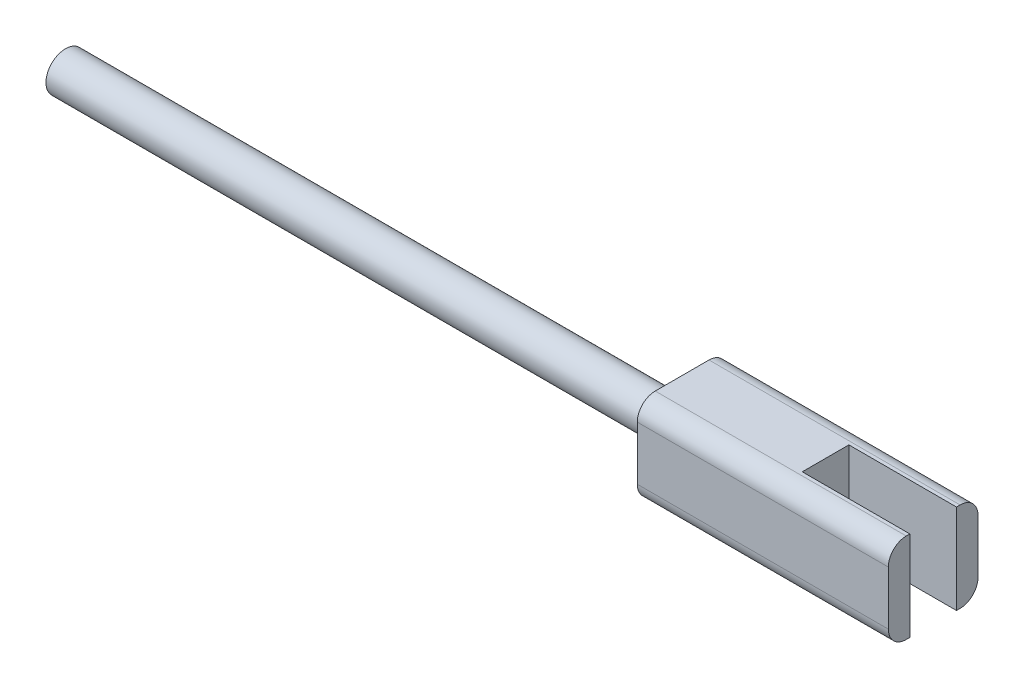
ISO-10303-21;
HEADER;
FILE_DESCRIPTION(('STEP AP214'),'2;1');
FILE_NAME('part.step','',(''),(''),'','','');
FILE_SCHEMA(('AUTOMOTIVE_DESIGN { 1 0 10303 214 1 1 1 1 }'));
ENDSEC;
DATA;
#1=APPLICATION_CONTEXT('core data for automotive mechanical design processes');
#2=APPLICATION_PROTOCOL_DEFINITION('international standard','automotive_design',2000,#1);
#3=PRODUCT_CONTEXT('',#1,'mechanical');
#4=PRODUCT('Part','Part','',(#3));
#5=PRODUCT_RELATED_PRODUCT_CATEGORY('part','',(#4));
#6=PRODUCT_DEFINITION_FORMATION('','',#4);
#7=PRODUCT_DEFINITION_CONTEXT('part definition',#1,'design');
#8=PRODUCT_DEFINITION('design','',#6,#7);
#9=PRODUCT_DEFINITION_SHAPE('','',#8);
#10=(LENGTH_UNIT() NAMED_UNIT(*) SI_UNIT(.MILLI.,.METRE.));
#11=(NAMED_UNIT(*) PLANE_ANGLE_UNIT() SI_UNIT($,.RADIAN.));
#12=(NAMED_UNIT(*) SI_UNIT($,.STERADIAN.) SOLID_ANGLE_UNIT());
#13=UNCERTAINTY_MEASURE_WITH_UNIT(LENGTH_MEASURE(1.E-05),#10,'distance_accuracy_value','');
#14=(GEOMETRIC_REPRESENTATION_CONTEXT(3) GLOBAL_UNCERTAINTY_ASSIGNED_CONTEXT((#13)) GLOBAL_UNIT_ASSIGNED_CONTEXT((#10,
#11,#12)) REPRESENTATION_CONTEXT('',''));
#15=CARTESIAN_POINT('',(0.,0.,0.));
#16=DIRECTION('',(0.,0.,1.));
#17=DIRECTION('',(1.,0.,0.));
#18=AXIS2_PLACEMENT_3D('',#15,#16,#17);
#19=CARTESIAN_POINT('',(48.385,-1.5,1.5));
#20=DIRECTION('',(1.,0.,0.));
#21=DIRECTION('',(0.,0.,-1.));
#22=AXIS2_PLACEMENT_3D('',#19,#20,#21);
#23=PLANE('',#22);
#24=DIRECTION('',(0.,1.,0.));
#25=VECTOR('',#24,1.);
#26=CARTESIAN_POINT('',(48.385,-1.5,-1.3));
#27=LINE('',#26,#25);
#28=CARTESIAN_POINT('',(48.385,-2.5,-1.3));
#29=VERTEX_POINT('',#28);
#30=CARTESIAN_POINT('',(48.385,2.5,-1.3));
#31=VERTEX_POINT('',#30);
#32=EDGE_CURVE('E11',#29,#31,#27,.T.);
#33=ORIENTED_EDGE('',*,*,#32,.F.);
#34=DIRECTION('',(0.,0.,-1.));
#35=VECTOR('',#34,1.);
#36=CARTESIAN_POINT('',(48.385,-2.5,1.5));
#37=LINE('',#36,#35);
#38=CARTESIAN_POINT('',(48.385,-2.5,-1.5));
#39=VERTEX_POINT('',#38);
#40=EDGE_CURVE('E202',#29,#39,#37,.T.);
#41=ORIENTED_EDGE('',*,*,#40,.T.);
#42=CARTESIAN_POINT('',(48.385,-1.5,-1.5));
#43=DIRECTION('',(1.,0.,0.));
#44=DIRECTION('',(0.,0.,-1.));
#45=AXIS2_PLACEMENT_3D('',#42,#43,#44);
#46=CIRCLE('',#45,1.);
#47=CARTESIAN_POINT('',(48.385,-1.5,-2.5));
#48=VERTEX_POINT('',#47);
#49=EDGE_CURVE('E201',#39,#48,#46,.T.);
#50=ORIENTED_EDGE('',*,*,#49,.T.);
#51=DIRECTION('',(0.,1.,0.));
#52=VECTOR('',#51,1.);
#53=CARTESIAN_POINT('',(48.385,-1.5,-2.5));
#54=LINE('',#53,#52);
#55=CARTESIAN_POINT('',(48.385,1.5,-2.5));
#56=VERTEX_POINT('',#55);
#57=EDGE_CURVE('E204',#48,#56,#54,.T.);
#58=ORIENTED_EDGE('',*,*,#57,.T.);
#59=CARTESIAN_POINT('',(48.385,1.5,-1.5));
#60=DIRECTION('',(1.,0.,0.));
#61=DIRECTION('',(0.,0.,-1.));
#62=AXIS2_PLACEMENT_3D('',#59,#60,#61);
#63=CIRCLE('',#62,1.);
#64=CARTESIAN_POINT('',(48.385,2.5,-1.5));
#65=VERTEX_POINT('',#64);
#66=EDGE_CURVE('E129',#56,#65,#63,.T.);
#67=ORIENTED_EDGE('',*,*,#66,.T.);
#68=DIRECTION('',(0.,0.,1.));
#69=VECTOR('',#68,1.);
#70=CARTESIAN_POINT('',(48.385,2.5,-1.5));
#71=LINE('',#70,#69);
#72=EDGE_CURVE('E128',#65,#31,#71,.T.);
#73=ORIENTED_EDGE('',*,*,#72,.T.);
#74=EDGE_LOOP('',(#33,#41,#50,#58,#67,#73));
#75=FACE_BOUND('',#74,.T.);
#76=ADVANCED_FACE('F39',(#75),#23,.T.);
#77=CARTESIAN_POINT('',(36.385,0.,0.));
#78=DIRECTION('',(-1.,0.,0.));
#79=DIRECTION('',(0.,0.,1.));
#80=AXIS2_PLACEMENT_3D('',#77,#78,#79);
#81=CYLINDRICAL_SURFACE('',#80,1.09);
#82=CARTESIAN_POINT('',(0.,0.,0.));
#83=DIRECTION('',(1.,0.,0.));
#84=DIRECTION('',(0.,0.,-1.));
#85=AXIS2_PLACEMENT_3D('',#82,#83,#84);
#86=CIRCLE('',#85,1.09);
#87=CARTESIAN_POINT('',(0.,0.,-1.09));
#88=VERTEX_POINT('',#87);
#89=EDGE_CURVE('E181',#88,#88,#86,.T.);
#90=ORIENTED_EDGE('',*,*,#89,.T.);
#91=EDGE_LOOP('',(#90));
#92=FACE_BOUND('',#91,.T.);
#93=CARTESIAN_POINT('',(34.385,0.,0.));
#94=DIRECTION('',(1.,0.,0.));
#95=DIRECTION('',(0.,0.,-1.));
#96=AXIS2_PLACEMENT_3D('',#93,#94,#95);
#97=CIRCLE('',#96,1.09);
#98=CARTESIAN_POINT('',(34.385,0.,-1.09));
#99=VERTEX_POINT('',#98);
#100=EDGE_CURVE('E184',#99,#99,#97,.T.);
#101=ORIENTED_EDGE('',*,*,#100,.F.);
#102=EDGE_LOOP('',(#101));
#103=FACE_BOUND('',#102,.T.);
#104=ADVANCED_FACE('F41',(#92,#103),#81,.T.);
#105=CARTESIAN_POINT('',(0.,0.,0.));
#106=DIRECTION('',(1.,0.,0.));
#107=DIRECTION('',(0.,0.,-1.));
#108=AXIS2_PLACEMENT_3D('',#105,#106,#107);
#109=PLANE('',#108);
#110=ORIENTED_EDGE('',*,*,#89,.F.);
#111=EDGE_LOOP('',(#110));
#112=FACE_BOUND('',#111,.T.);
#113=ADVANCED_FACE('F264',(#112),#109,.F.);
#114=CARTESIAN_POINT('',(48.385,-1.5,1.5));
#115=DIRECTION('',(-1.,0.,0.));
#116=DIRECTION('',(0.,0.,1.));
#117=AXIS2_PLACEMENT_3D('',#114,#115,#116);
#118=CYLINDRICAL_SURFACE('',#117,1.);
#119=CARTESIAN_POINT('',(34.385,-1.5,1.5));
#120=DIRECTION('',(1.,0.,0.));
#121=DIRECTION('',(0.,0.,-1.));
#122=AXIS2_PLACEMENT_3D('',#119,#120,#121);
#123=CIRCLE('',#122,1.);
#124=CARTESIAN_POINT('',(34.385,-1.5,2.5));
#125=VERTEX_POINT('',#124);
#126=CARTESIAN_POINT('',(34.385,-2.5,1.5));
#127=VERTEX_POINT('',#126);
#128=EDGE_CURVE('E150',#125,#127,#123,.T.);
#129=ORIENTED_EDGE('',*,*,#128,.T.);
#130=DIRECTION('',(-1.,0.,0.));
#131=VECTOR('',#130,1.);
#132=CARTESIAN_POINT('',(48.385,-2.5,1.5));
#133=LINE('',#132,#131);
#134=CARTESIAN_POINT('',(48.385,-2.5,1.5));
#135=VERTEX_POINT('',#134);
#136=EDGE_CURVE('E179',#135,#127,#133,.T.);
#137=ORIENTED_EDGE('',*,*,#136,.F.);
#138=CARTESIAN_POINT('',(48.385,-1.5,1.5));
#139=DIRECTION('',(1.,0.,0.));
#140=DIRECTION('',(0.,0.,-1.));
#141=AXIS2_PLACEMENT_3D('',#138,#139,#140);
#142=CIRCLE('',#141,1.);
#143=CARTESIAN_POINT('',(48.385,-1.5,2.5));
#144=VERTEX_POINT('',#143);
#145=EDGE_CURVE('E166',#144,#135,#142,.T.);
#146=ORIENTED_EDGE('',*,*,#145,.F.);
#147=DIRECTION('',(-1.,0.,0.));
#148=VECTOR('',#147,1.);
#149=CARTESIAN_POINT('',(48.385,-1.5,2.5));
#150=LINE('',#149,#148);
#151=EDGE_CURVE('E145',#144,#125,#150,.T.);
#152=ORIENTED_EDGE('',*,*,#151,.T.);
#153=EDGE_LOOP('',(#129,#137,#146,#152));
#154=FACE_BOUND('',#153,.T.);
#155=ADVANCED_FACE('F262',(#154),#118,.T.);
#156=CARTESIAN_POINT('',(48.385,-2.5,1.5));
#157=DIRECTION('',(0.,1.,0.));
#158=DIRECTION('',(0.,0.,1.));
#159=AXIS2_PLACEMENT_3D('',#156,#157,#158);
#160=PLANE('',#159);
#161=ORIENTED_EDGE('',*,*,#40,.F.);
#162=DIRECTION('',(-1.,0.,0.));
#163=VECTOR('',#162,1.);
#164=CARTESIAN_POINT('',(42.385,-2.5,-1.3));
#165=LINE('',#164,#163);
#166=CARTESIAN_POINT('',(42.385,-2.5,-1.3));
#167=VERTEX_POINT('',#166);
#168=EDGE_CURVE('E197',#29,#167,#165,.T.);
#169=ORIENTED_EDGE('',*,*,#168,.T.);
#170=DIRECTION('',(0.,0.,1.));
#171=VECTOR('',#170,1.);
#172=CARTESIAN_POINT('',(42.385,-2.5,1.3));
#173=LINE('',#172,#171);
#174=CARTESIAN_POINT('',(42.385,-2.5,1.3));
#175=VERTEX_POINT('',#174);
#176=EDGE_CURVE('E196',#167,#175,#173,.T.);
#177=ORIENTED_EDGE('',*,*,#176,.T.);
#178=DIRECTION('',(1.,0.,0.));
#179=VECTOR('',#178,1.);
#180=CARTESIAN_POINT('',(49.385,-2.5,1.3));
#181=LINE('',#180,#179);
#182=CARTESIAN_POINT('',(48.385,-2.5,1.3));
#183=VERTEX_POINT('',#182);
#184=EDGE_CURVE('E189',#175,#183,#181,.T.);
#185=ORIENTED_EDGE('',*,*,#184,.T.);
#186=EDGE_CURVE('E105',#135,#183,#37,.T.);
#187=ORIENTED_EDGE('',*,*,#186,.F.);
#188=ORIENTED_EDGE('',*,*,#136,.T.);
#189=DIRECTION('',(0.,0.,-1.));
#190=VECTOR('',#189,1.);
#191=CARTESIAN_POINT('',(34.385,-2.5,1.5));
#192=LINE('',#191,#190);
#193=CARTESIAN_POINT('',(34.385,-2.5,-1.5));
#194=VERTEX_POINT('',#193);
#195=EDGE_CURVE('E153',#127,#194,#192,.T.);
#196=ORIENTED_EDGE('',*,*,#195,.T.);
#197=DIRECTION('',(-1.,0.,0.));
#198=VECTOR('',#197,1.);
#199=CARTESIAN_POINT('',(48.385,-2.5,-1.5));
#200=LINE('',#199,#198);
#201=EDGE_CURVE('E176',#39,#194,#200,.T.);
#202=ORIENTED_EDGE('',*,*,#201,.F.);
#203=EDGE_LOOP('',(#161,#169,#177,#185,#187,#188,#196,#202));
#204=FACE_BOUND('',#203,.T.);
#205=ADVANCED_FACE('F193',(#204),#160,.F.);
#206=CARTESIAN_POINT('',(48.385,-1.5,-1.5));
#207=DIRECTION('',(-1.,0.,0.));
#208=DIRECTION('',(0.,0.,1.));
#209=AXIS2_PLACEMENT_3D('',#206,#207,#208);
#210=CYLINDRICAL_SURFACE('',#209,1.);
#211=CARTESIAN_POINT('',(34.385,-1.5,-1.5));
#212=DIRECTION('',(1.,0.,0.));
#213=DIRECTION('',(0.,0.,-1.));
#214=AXIS2_PLACEMENT_3D('',#211,#212,#213);
#215=CIRCLE('',#214,1.);
#216=CARTESIAN_POINT('',(34.385,-1.5,-2.5));
#217=VERTEX_POINT('',#216);
#218=EDGE_CURVE('E156',#194,#217,#215,.T.);
#219=ORIENTED_EDGE('',*,*,#218,.T.);
#220=DIRECTION('',(-1.,0.,0.));
#221=VECTOR('',#220,1.);
#222=CARTESIAN_POINT('',(48.385,-1.5,-2.5));
#223=LINE('',#222,#221);
#224=EDGE_CURVE('E173',#48,#217,#223,.T.);
#225=ORIENTED_EDGE('',*,*,#224,.F.);
#226=ORIENTED_EDGE('',*,*,#49,.F.);
#227=ORIENTED_EDGE('',*,*,#201,.T.);
#228=EDGE_LOOP('',(#219,#225,#226,#227));
#229=FACE_BOUND('',#228,.T.);
#230=ADVANCED_FACE('F253',(#229),#210,.T.);
#231=CARTESIAN_POINT('',(48.385,-1.5,-2.5));
#232=DIRECTION('',(0.,0.,1.));
#233=DIRECTION('',(1.,0.,0.));
#234=AXIS2_PLACEMENT_3D('',#231,#232,#233);
#235=PLANE('',#234);
#236=DIRECTION('',(0.,1.,0.));
#237=VECTOR('',#236,1.);
#238=CARTESIAN_POINT('',(34.385,-1.5,-2.5));
#239=LINE('',#238,#237);
#240=CARTESIAN_POINT('',(34.385,1.5,-2.5));
#241=VERTEX_POINT('',#240);
#242=EDGE_CURVE('E158',#217,#241,#239,.T.);
#243=ORIENTED_EDGE('',*,*,#242,.T.);
#244=DIRECTION('',(-1.,0.,0.));
#245=VECTOR('',#244,1.);
#246=CARTESIAN_POINT('',(48.385,1.5,-2.5));
#247=LINE('',#246,#245);
#248=EDGE_CURVE('E170',#56,#241,#247,.T.);
#249=ORIENTED_EDGE('',*,*,#248,.F.);
#250=ORIENTED_EDGE('',*,*,#57,.F.);
#251=ORIENTED_EDGE('',*,*,#224,.T.);
#252=EDGE_LOOP('',(#243,#249,#250,#251));
#253=FACE_BOUND('',#252,.T.);
#254=ADVANCED_FACE('F256',(#253),#235,.F.);
#255=CARTESIAN_POINT('',(48.385,1.5,-1.5));
#256=DIRECTION('',(-1.,0.,0.));
#257=DIRECTION('',(0.,0.,1.));
#258=AXIS2_PLACEMENT_3D('',#255,#256,#257);
#259=CYLINDRICAL_SURFACE('',#258,1.);
#260=CARTESIAN_POINT('',(34.385,1.5,-1.5));
#261=DIRECTION('',(1.,0.,0.));
#262=DIRECTION('',(0.,0.,-1.));
#263=AXIS2_PLACEMENT_3D('',#260,#261,#262);
#264=CIRCLE('',#263,1.);
#265=CARTESIAN_POINT('',(34.385,2.5,-1.5));
#266=VERTEX_POINT('',#265);
#267=EDGE_CURVE('E160',#241,#266,#264,.T.);
#268=ORIENTED_EDGE('',*,*,#267,.T.);
#269=DIRECTION('',(-1.,0.,0.));
#270=VECTOR('',#269,1.);
#271=CARTESIAN_POINT('',(48.385,2.5,-1.5));
#272=LINE('',#271,#270);
#273=EDGE_CURVE('E140',#65,#266,#272,.T.);
#274=ORIENTED_EDGE('',*,*,#273,.F.);
#275=ORIENTED_EDGE('',*,*,#66,.F.);
#276=ORIENTED_EDGE('',*,*,#248,.T.);
#277=EDGE_LOOP('',(#268,#274,#275,#276));
#278=FACE_BOUND('',#277,.T.);
#279=ADVANCED_FACE('F218',(#278),#259,.T.);
#280=CARTESIAN_POINT('',(48.385,2.5,-1.5));
#281=DIRECTION('',(0.,-1.,0.));
#282=DIRECTION('',(0.,0.,-1.));
#283=AXIS2_PLACEMENT_3D('',#280,#281,#282);
#284=PLANE('',#283);
#285=DIRECTION('',(0.,0.,1.));
#286=VECTOR('',#285,1.);
#287=CARTESIAN_POINT('',(42.385,2.5,1.3));
#288=LINE('',#287,#286);
#289=CARTESIAN_POINT('',(42.385,2.5,-1.3));
#290=VERTEX_POINT('',#289);
#291=CARTESIAN_POINT('',(42.385,2.5,1.3));
#292=VERTEX_POINT('',#291);
#293=EDGE_CURVE('E225',#290,#292,#288,.T.);
#294=ORIENTED_EDGE('',*,*,#293,.F.);
#295=DIRECTION('',(-1.,0.,0.));
#296=VECTOR('',#295,1.);
#297=CARTESIAN_POINT('',(42.385,2.5,-1.3));
#298=LINE('',#297,#296);
#299=EDGE_CURVE('E222',#31,#290,#298,.T.);
#300=ORIENTED_EDGE('',*,*,#299,.F.);
#301=ORIENTED_EDGE('',*,*,#72,.F.);
#302=ORIENTED_EDGE('',*,*,#273,.T.);
#303=DIRECTION('',(0.,0.,1.));
#304=VECTOR('',#303,1.);
#305=CARTESIAN_POINT('',(34.385,2.5,-1.5));
#306=LINE('',#305,#304);
#307=CARTESIAN_POINT('',(34.385,2.5,1.5));
#308=VERTEX_POINT('',#307);
#309=EDGE_CURVE('E137',#266,#308,#306,.T.);
#310=ORIENTED_EDGE('',*,*,#309,.T.);
#311=DIRECTION('',(-1.,0.,0.));
#312=VECTOR('',#311,1.);
#313=CARTESIAN_POINT('',(48.385,2.5,1.5));
#314=LINE('',#313,#312);
#315=CARTESIAN_POINT('',(48.385,2.5,1.5));
#316=VERTEX_POINT('',#315);
#317=EDGE_CURVE('E132',#316,#308,#314,.T.);
#318=ORIENTED_EDGE('',*,*,#317,.F.);
#319=CARTESIAN_POINT('',(48.385,2.5,1.3));
#320=VERTEX_POINT('',#319);
#321=EDGE_CURVE('E121',#320,#316,#71,.T.);
#322=ORIENTED_EDGE('',*,*,#321,.F.);
#323=DIRECTION('',(1.,0.,0.));
#324=VECTOR('',#323,1.);
#325=CARTESIAN_POINT('',(49.385,2.5,1.3));
#326=LINE('',#325,#324);
#327=EDGE_CURVE('E54',#292,#320,#326,.T.);
#328=ORIENTED_EDGE('',*,*,#327,.F.);
#329=EDGE_LOOP('',(#294,#300,#301,#302,#310,#318,#322,#328));
#330=FACE_BOUND('',#329,.T.);
#331=ADVANCED_FACE('F134',(#330),#284,.F.);
#332=CARTESIAN_POINT('',(48.385,1.5,1.5));
#333=DIRECTION('',(-1.,0.,0.));
#334=DIRECTION('',(0.,0.,1.));
#335=AXIS2_PLACEMENT_3D('',#332,#333,#334);
#336=CYLINDRICAL_SURFACE('',#335,1.);
#337=CARTESIAN_POINT('',(34.385,1.5,1.5));
#338=DIRECTION('',(1.,0.,0.));
#339=DIRECTION('',(0.,0.,-1.));
#340=AXIS2_PLACEMENT_3D('',#337,#338,#339);
#341=CIRCLE('',#340,1.);
#342=CARTESIAN_POINT('',(34.385,1.5,2.5));
#343=VERTEX_POINT('',#342);
#344=EDGE_CURVE('E163',#308,#343,#341,.T.);
#345=ORIENTED_EDGE('',*,*,#344,.T.);
#346=DIRECTION('',(-1.,0.,0.));
#347=VECTOR('',#346,1.);
#348=CARTESIAN_POINT('',(48.385,1.5,2.5));
#349=LINE('',#348,#347);
#350=CARTESIAN_POINT('',(48.385,1.5,2.5));
#351=VERTEX_POINT('',#350);
#352=EDGE_CURVE('E141',#351,#343,#349,.T.);
#353=ORIENTED_EDGE('',*,*,#352,.F.);
#354=CARTESIAN_POINT('',(48.385,1.5,1.5));
#355=DIRECTION('',(1.,0.,0.));
#356=DIRECTION('',(0.,0.,-1.));
#357=AXIS2_PLACEMENT_3D('',#354,#355,#356);
#358=CIRCLE('',#357,1.);
#359=EDGE_CURVE('E125',#316,#351,#358,.T.);
#360=ORIENTED_EDGE('',*,*,#359,.F.);
#361=ORIENTED_EDGE('',*,*,#317,.T.);
#362=EDGE_LOOP('',(#345,#353,#360,#361));
#363=FACE_BOUND('',#362,.T.);
#364=ADVANCED_FACE('F143',(#363),#336,.T.);
#365=CARTESIAN_POINT('',(48.385,1.5,2.5));
#366=DIRECTION('',(0.,0.,-1.));
#367=DIRECTION('',(-1.,0.,0.));
#368=AXIS2_PLACEMENT_3D('',#365,#366,#367);
#369=PLANE('',#368);
#370=DIRECTION('',(0.,-1.,0.));
#371=VECTOR('',#370,1.);
#372=CARTESIAN_POINT('',(34.385,1.5,2.5));
#373=LINE('',#372,#371);
#374=EDGE_CURVE('E96',#343,#125,#373,.T.);
#375=ORIENTED_EDGE('',*,*,#374,.T.);
#376=ORIENTED_EDGE('',*,*,#151,.F.);
#377=DIRECTION('',(0.,-1.,0.));
#378=VECTOR('',#377,1.);
#379=CARTESIAN_POINT('',(48.385,1.5,2.5));
#380=LINE('',#379,#378);
#381=EDGE_CURVE('E63',#351,#144,#380,.T.);
#382=ORIENTED_EDGE('',*,*,#381,.F.);
#383=ORIENTED_EDGE('',*,*,#352,.T.);
#384=EDGE_LOOP('',(#375,#376,#382,#383));
#385=FACE_BOUND('',#384,.T.);
#386=ADVANCED_FACE('F260',(#385),#369,.F.);
#387=DIRECTION('',(0.,-1.,0.));
#388=VECTOR('',#387,1.);
#389=CARTESIAN_POINT('',(48.385,-1.5,1.3));
#390=LINE('',#389,#388);
#391=EDGE_CURVE('E47',#320,#183,#390,.T.);
#392=ORIENTED_EDGE('',*,*,#391,.F.);
#393=ORIENTED_EDGE('',*,*,#321,.T.);
#394=ORIENTED_EDGE('',*,*,#359,.T.);
#395=ORIENTED_EDGE('',*,*,#381,.T.);
#396=ORIENTED_EDGE('',*,*,#145,.T.);
#397=ORIENTED_EDGE('',*,*,#186,.T.);
#398=EDGE_LOOP('',(#392,#393,#394,#395,#396,#397));
#399=FACE_BOUND('',#398,.T.);
#400=ADVANCED_FACE('F123',(#399),#23,.T.);
#401=CARTESIAN_POINT('',(34.385,-1.5,1.5));
#402=DIRECTION('',(1.,0.,0.));
#403=DIRECTION('',(0.,0.,-1.));
#404=AXIS2_PLACEMENT_3D('',#401,#402,#403);
#405=PLANE('',#404);
#406=ORIENTED_EDGE('',*,*,#100,.T.);
#407=EDGE_LOOP('',(#406));
#408=FACE_BOUND('',#407,.T.);
#409=ORIENTED_EDGE('',*,*,#128,.F.);
#410=ORIENTED_EDGE('',*,*,#374,.F.);
#411=ORIENTED_EDGE('',*,*,#344,.F.);
#412=ORIENTED_EDGE('',*,*,#309,.F.);
#413=ORIENTED_EDGE('',*,*,#267,.F.);
#414=ORIENTED_EDGE('',*,*,#242,.F.);
#415=ORIENTED_EDGE('',*,*,#218,.F.);
#416=ORIENTED_EDGE('',*,*,#195,.F.);
#417=EDGE_LOOP('',(#409,#410,#411,#412,#413,#414,#415,#416));
#418=FACE_BOUND('',#417,.T.);
#419=ADVANCED_FACE('F259',(#408,#418),#405,.F.);
#420=CARTESIAN_POINT('',(42.385,-2.5,1.3));
#421=DIRECTION('',(-1.,0.,0.));
#422=DIRECTION('',(0.,0.,1.));
#423=AXIS2_PLACEMENT_3D('',#420,#421,#422);
#424=PLANE('',#423);
#425=DIRECTION('',(0.,1.,0.));
#426=VECTOR('',#425,1.);
#427=CARTESIAN_POINT('',(42.385,-2.5,1.3));
#428=LINE('',#427,#426);
#429=EDGE_CURVE('E237',#175,#292,#428,.T.);
#430=ORIENTED_EDGE('',*,*,#429,.F.);
#431=ORIENTED_EDGE('',*,*,#176,.F.);
#432=DIRECTION('',(0.,1.,0.));
#433=VECTOR('',#432,1.);
#434=CARTESIAN_POINT('',(42.385,-2.5,-1.3));
#435=LINE('',#434,#433);
#436=EDGE_CURVE('E154',#167,#290,#435,.T.);
#437=ORIENTED_EDGE('',*,*,#436,.T.);
#438=ORIENTED_EDGE('',*,*,#293,.T.);
#439=EDGE_LOOP('',(#430,#431,#437,#438));
#440=FACE_BOUND('',#439,.T.);
#441=ADVANCED_FACE('F242',(#440),#424,.F.);
#442=CARTESIAN_POINT('',(42.385,-2.5,-1.3));
#443=DIRECTION('',(0.,0.,-1.));
#444=DIRECTION('',(-1.,0.,0.));
#445=AXIS2_PLACEMENT_3D('',#442,#443,#444);
#446=PLANE('',#445);
#447=ORIENTED_EDGE('',*,*,#32,.T.);
#448=ORIENTED_EDGE('',*,*,#299,.T.);
#449=ORIENTED_EDGE('',*,*,#436,.F.);
#450=ORIENTED_EDGE('',*,*,#168,.F.);
#451=EDGE_LOOP('',(#447,#448,#449,#450));
#452=FACE_BOUND('',#451,.T.);
#453=ADVANCED_FACE('F245',(#452),#446,.F.);
#454=CARTESIAN_POINT('',(49.385,-2.5,1.3));
#455=DIRECTION('',(0.,0.,1.));
#456=DIRECTION('',(1.,0.,0.));
#457=AXIS2_PLACEMENT_3D('',#454,#455,#456);
#458=PLANE('',#457);
#459=ORIENTED_EDGE('',*,*,#391,.T.);
#460=ORIENTED_EDGE('',*,*,#184,.F.);
#461=ORIENTED_EDGE('',*,*,#429,.T.);
#462=ORIENTED_EDGE('',*,*,#327,.T.);
#463=EDGE_LOOP('',(#459,#460,#461,#462));
#464=FACE_BOUND('',#463,.T.);
#465=ADVANCED_FACE('F187',(#464),#458,.F.);
#466=CLOSED_SHELL('',(#76,#104,#113,#155,#205,#230,#254,#279,#331,#364,#386,#400,#419,#441,#453,#465));
#467=MANIFOLD_SOLID_BREP('B2',#466);
#468=ADVANCED_BREP_SHAPE_REPRESENTATION('',(#18,#467),#14);
#469=SHAPE_DEFINITION_REPRESENTATION(#9,#468);
ENDSEC;
END-ISO-10303-21;
